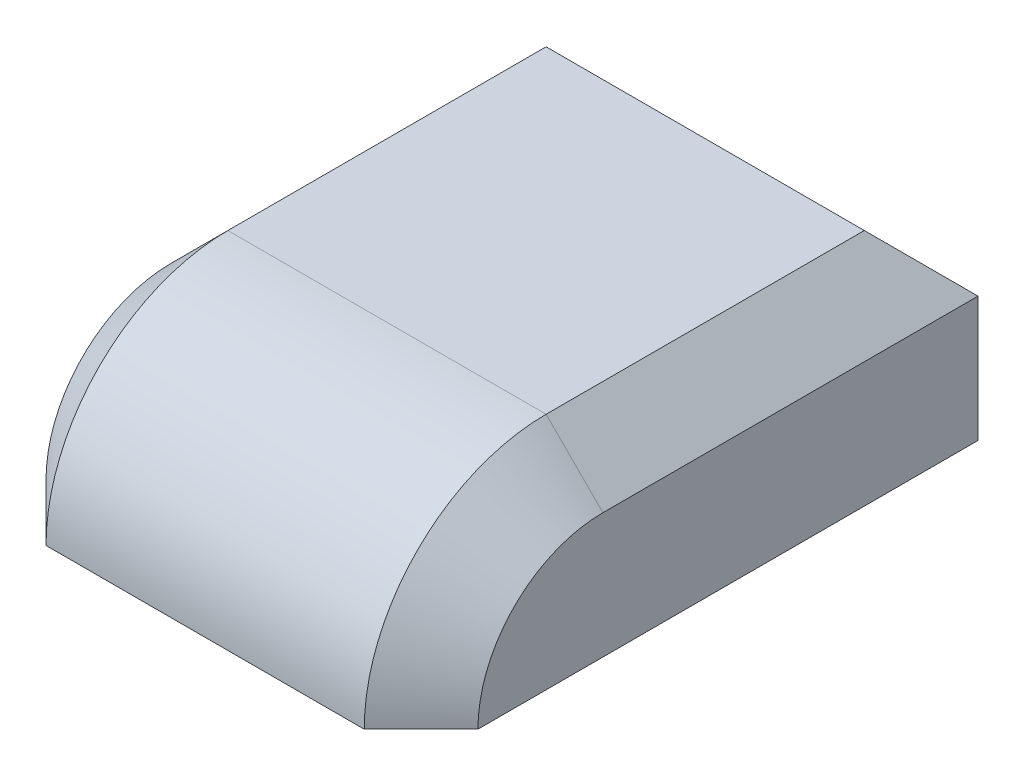
ISO-10303-21;
HEADER;
FILE_DESCRIPTION(('STEP AP214'),'2;1');
FILE_NAME('part.step','',(''),(''),'','','');
FILE_SCHEMA(('AUTOMOTIVE_DESIGN { 1 0 10303 214 1 1 1 1 }'));
ENDSEC;
DATA;
#1=APPLICATION_CONTEXT('core data for automotive mechanical design processes');
#2=APPLICATION_PROTOCOL_DEFINITION('international standard','automotive_design',2000,#1);
#3=PRODUCT_CONTEXT('',#1,'mechanical');
#4=PRODUCT('Part','Part','',(#3));
#5=PRODUCT_RELATED_PRODUCT_CATEGORY('part','',(#4));
#6=PRODUCT_DEFINITION_FORMATION('','',#4);
#7=PRODUCT_DEFINITION_CONTEXT('part definition',#1,'design');
#8=PRODUCT_DEFINITION('design','',#6,#7);
#9=PRODUCT_DEFINITION_SHAPE('','',#8);
#10=(LENGTH_UNIT() NAMED_UNIT(*) SI_UNIT(.MILLI.,.METRE.));
#11=(NAMED_UNIT(*) PLANE_ANGLE_UNIT() SI_UNIT($,.RADIAN.));
#12=(NAMED_UNIT(*) SI_UNIT($,.STERADIAN.) SOLID_ANGLE_UNIT());
#13=UNCERTAINTY_MEASURE_WITH_UNIT(LENGTH_MEASURE(1.E-05),#10,'distance_accuracy_value','');
#14=(GEOMETRIC_REPRESENTATION_CONTEXT(3) GLOBAL_UNCERTAINTY_ASSIGNED_CONTEXT((#13)) GLOBAL_UNIT_ASSIGNED_CONTEXT((#10,
#11,#12)) REPRESENTATION_CONTEXT('',''));
#15=CARTESIAN_POINT('',(0.,0.,0.));
#16=DIRECTION('',(0.,0.,1.));
#17=DIRECTION('',(1.,0.,0.));
#18=AXIS2_PLACEMENT_3D('',#15,#16,#17);
#19=CARTESIAN_POINT('',(19.,16.,24.5));
#20=DIRECTION('',(-1.,0.,0.));
#21=DIRECTION('',(0.,0.,1.));
#22=AXIS2_PLACEMENT_3D('',#19,#20,#21);
#23=PLANE('',#22);
#24=DIRECTION('',(0.,0.,1.));
#25=VECTOR('',#24,1.);
#26=CARTESIAN_POINT('',(19.,11.,24.5));
#27=LINE('',#26,#25);
#28=CARTESIAN_POINT('',(19.,11.,-24.5));
#29=VERTEX_POINT('',#28);
#30=CARTESIAN_POINT('',(19.,11.,8.5));
#31=VERTEX_POINT('',#30);
#32=EDGE_CURVE('E141',#29,#31,#27,.T.);
#33=ORIENTED_EDGE('',*,*,#32,.T.);
#34=CARTESIAN_POINT('',(19.,0.,8.5));
#35=DIRECTION('',(-1.,0.,0.));
#36=DIRECTION('',(0.,0.,1.));
#37=AXIS2_PLACEMENT_3D('',#34,#35,#36);
#38=CIRCLE('',#37,11.);
#39=CARTESIAN_POINT('',(19.,0.,19.5));
#40=VERTEX_POINT('',#39);
#41=EDGE_CURVE('E112',#31,#40,#38,.F.);
#42=ORIENTED_EDGE('',*,*,#41,.T.);
#43=DIRECTION('',(0.,0.,-1.));
#44=VECTOR('',#43,1.);
#45=CARTESIAN_POINT('',(19.,0.,24.5));
#46=LINE('',#45,#44);
#47=CARTESIAN_POINT('',(19.,0.,-24.5));
#48=VERTEX_POINT('',#47);
#49=EDGE_CURVE('E110',#40,#48,#46,.T.);
#50=ORIENTED_EDGE('',*,*,#49,.T.);
#51=DIRECTION('',(0.,-1.,0.));
#52=VECTOR('',#51,1.);
#53=CARTESIAN_POINT('',(19.,16.,-24.5));
#54=LINE('',#53,#52);
#55=EDGE_CURVE('E96',#29,#48,#54,.T.);
#56=ORIENTED_EDGE('',*,*,#55,.F.);
#57=EDGE_LOOP('',(#33,#42,#50,#56));
#58=FACE_BOUND('',#57,.T.);
#59=ADVANCED_FACE('F35',(#58),#23,.F.);
#60=CARTESIAN_POINT('',(-19.,16.,-24.5));
#61=DIRECTION('',(0.,0.,1.));
#62=DIRECTION('',(1.,0.,0.));
#63=AXIS2_PLACEMENT_3D('',#60,#61,#62);
#64=PLANE('',#63);
#65=DIRECTION('',(0.,-1.,0.));
#66=VECTOR('',#65,1.);
#67=CARTESIAN_POINT('',(-19.,16.,-24.5));
#68=LINE('',#67,#66);
#69=CARTESIAN_POINT('',(-19.,11.,-24.5));
#70=VERTEX_POINT('',#69);
#71=CARTESIAN_POINT('',(-19.,0.,-24.5));
#72=VERTEX_POINT('',#71);
#73=EDGE_CURVE('E107',#70,#72,#68,.T.);
#74=ORIENTED_EDGE('',*,*,#73,.F.);
#75=DIRECTION('',(1.,0.,0.));
#76=VECTOR('',#75,1.);
#77=CARTESIAN_POINT('',(-19.,11.,-24.5));
#78=LINE('',#77,#76);
#79=EDGE_CURVE('E11',#70,#29,#78,.T.);
#80=ORIENTED_EDGE('',*,*,#79,.T.);
#81=ORIENTED_EDGE('',*,*,#55,.T.);
#82=DIRECTION('',(-1.,0.,0.));
#83=VECTOR('',#82,1.);
#84=CARTESIAN_POINT('',(-19.,0.,-24.5));
#85=LINE('',#84,#83);
#86=EDGE_CURVE('E101',#48,#72,#85,.T.);
#87=ORIENTED_EDGE('',*,*,#86,.T.);
#88=EDGE_LOOP('',(#74,#80,#81,#87));
#89=FACE_BOUND('',#88,.T.);
#90=ADVANCED_FACE('F99',(#89),#64,.F.);
#91=CARTESIAN_POINT('',(-19.,16.,24.5));
#92=DIRECTION('',(1.,0.,0.));
#93=DIRECTION('',(0.,0.,-1.));
#94=AXIS2_PLACEMENT_3D('',#91,#92,#93);
#95=PLANE('',#94);
#96=DIRECTION('',(0.,0.,1.));
#97=VECTOR('',#96,1.);
#98=CARTESIAN_POINT('',(-19.,0.,24.5));
#99=LINE('',#98,#97);
#100=CARTESIAN_POINT('',(-19.,0.,19.5));
#101=VERTEX_POINT('',#100);
#102=EDGE_CURVE('E119',#72,#101,#99,.T.);
#103=ORIENTED_EDGE('',*,*,#102,.T.);
#104=CARTESIAN_POINT('',(-19.,0.,8.5));
#105=DIRECTION('',(1.,0.,0.));
#106=DIRECTION('',(0.,0.,-1.));
#107=AXIS2_PLACEMENT_3D('',#104,#105,#106);
#108=CIRCLE('',#107,11.);
#109=CARTESIAN_POINT('',(-19.,11.,8.5));
#110=VERTEX_POINT('',#109);
#111=EDGE_CURVE('E130',#101,#110,#108,.F.);
#112=ORIENTED_EDGE('',*,*,#111,.T.);
#113=DIRECTION('',(0.,0.,-1.));
#114=VECTOR('',#113,1.);
#115=CARTESIAN_POINT('',(-19.,11.,24.5));
#116=LINE('',#115,#114);
#117=EDGE_CURVE('E128',#110,#70,#116,.T.);
#118=ORIENTED_EDGE('',*,*,#117,.T.);
#119=ORIENTED_EDGE('',*,*,#73,.T.);
#120=EDGE_LOOP('',(#103,#112,#118,#119));
#121=FACE_BOUND('',#120,.T.);
#122=ADVANCED_FACE('F174',(#121),#95,.F.);
#123=CARTESIAN_POINT('',(0.,16.,0.));
#124=DIRECTION('',(0.,-1.,0.));
#125=DIRECTION('',(0.,0.,-1.));
#126=AXIS2_PLACEMENT_3D('',#123,#124,#125);
#127=PLANE('',#126);
#128=DIRECTION('',(-1.,0.,0.));
#129=VECTOR('',#128,1.);
#130=CARTESIAN_POINT('',(0.,16.,-19.5));
#131=LINE('',#130,#129);
#132=CARTESIAN_POINT('',(14.,16.,-19.5));
#133=VERTEX_POINT('',#132);
#134=CARTESIAN_POINT('',(-14.,16.,-19.5));
#135=VERTEX_POINT('',#134);
#136=EDGE_CURVE('E53',#133,#135,#131,.T.);
#137=ORIENTED_EDGE('',*,*,#136,.T.);
#138=DIRECTION('',(0.,0.,1.));
#139=VECTOR('',#138,1.);
#140=CARTESIAN_POINT('',(-14.,16.,0.));
#141=LINE('',#140,#139);
#142=CARTESIAN_POINT('',(-14.,16.,8.5));
#143=VERTEX_POINT('',#142);
#144=EDGE_CURVE('E45',#135,#143,#141,.T.);
#145=ORIENTED_EDGE('',*,*,#144,.T.);
#146=DIRECTION('',(1.,0.,0.));
#147=VECTOR('',#146,1.);
#148=CARTESIAN_POINT('',(0.,16.,8.5));
#149=LINE('',#148,#147);
#150=CARTESIAN_POINT('',(14.,16.,8.5));
#151=VERTEX_POINT('',#150);
#152=EDGE_CURVE('E106',#143,#151,#149,.T.);
#153=ORIENTED_EDGE('',*,*,#152,.T.);
#154=DIRECTION('',(0.,0.,-1.));
#155=VECTOR('',#154,1.);
#156=CARTESIAN_POINT('',(14.,16.,0.));
#157=LINE('',#156,#155);
#158=EDGE_CURVE('E58',#151,#133,#157,.T.);
#159=ORIENTED_EDGE('',*,*,#158,.T.);
#160=EDGE_LOOP('',(#137,#145,#153,#159));
#161=FACE_BOUND('',#160,.T.);
#162=ADVANCED_FACE('F246',(#161),#127,.F.);
#163=CARTESIAN_POINT('',(0.,0.,0.));
#164=DIRECTION('',(0.,-1.,0.));
#165=DIRECTION('',(0.,0.,-1.));
#166=AXIS2_PLACEMENT_3D('',#163,#164,#165);
#167=PLANE('',#166);
#168=DIRECTION('',(1.,0.,0.));
#169=VECTOR('',#168,1.);
#170=CARTESIAN_POINT('',(-19.,0.,24.5));
#171=LINE('',#170,#169);
#172=CARTESIAN_POINT('',(-14.,0.,24.5));
#173=VERTEX_POINT('',#172);
#174=CARTESIAN_POINT('',(14.,0.,24.5));
#175=VERTEX_POINT('',#174);
#176=EDGE_CURVE('E121',#173,#175,#171,.T.);
#177=ORIENTED_EDGE('',*,*,#176,.F.);
#178=DIRECTION('',(-0.707106781186546,0.,-0.707106781186549));
#179=VECTOR('',#178,1.);
#180=CARTESIAN_POINT('',(-29.9999999999999,0.,8.5));
#181=LINE('',#180,#179);
#182=EDGE_CURVE('E139',#173,#101,#181,.T.);
#183=ORIENTED_EDGE('',*,*,#182,.T.);
#184=ORIENTED_EDGE('',*,*,#102,.F.);
#185=ORIENTED_EDGE('',*,*,#86,.F.);
#186=ORIENTED_EDGE('',*,*,#49,.F.);
#187=DIRECTION('',(-0.707106781186546,0.,0.707106781186549));
#188=VECTOR('',#187,1.);
#189=CARTESIAN_POINT('',(29.9999999999999,0.,8.5));
#190=LINE('',#189,#188);
#191=EDGE_CURVE('E137',#40,#175,#190,.T.);
#192=ORIENTED_EDGE('',*,*,#191,.T.);
#193=EDGE_LOOP('',(#177,#183,#184,#185,#186,#192));
#194=FACE_BOUND('',#193,.T.);
#195=ADVANCED_FACE('F117',(#194),#167,.T.);
#196=CARTESIAN_POINT('',(0.,0.,8.5));
#197=DIRECTION('',(1.,0.,0.));
#198=DIRECTION('',(0.,0.,-1.));
#199=AXIS2_PLACEMENT_3D('',#196,#197,#198);
#200=CYLINDRICAL_SURFACE('',#199,16.);
#201=ORIENTED_EDGE('',*,*,#152,.F.);
#202=CARTESIAN_POINT('',(-14.,0.,8.5));
#203=DIRECTION('',(1.,0.,0.));
#204=DIRECTION('',(0.,0.,-1.));
#205=AXIS2_PLACEMENT_3D('',#202,#203,#204);
#206=CIRCLE('',#205,16.);
#207=EDGE_CURVE('E135',#143,#173,#206,.T.);
#208=ORIENTED_EDGE('',*,*,#207,.T.);
#209=ORIENTED_EDGE('',*,*,#176,.T.);
#210=CARTESIAN_POINT('',(14.,0.,8.5));
#211=DIRECTION('',(-1.,0.,0.));
#212=DIRECTION('',(0.,0.,1.));
#213=AXIS2_PLACEMENT_3D('',#210,#211,#212);
#214=CIRCLE('',#213,16.);
#215=EDGE_CURVE('E133',#175,#151,#214,.T.);
#216=ORIENTED_EDGE('',*,*,#215,.T.);
#217=EDGE_LOOP('',(#201,#208,#209,#216));
#218=FACE_BOUND('',#217,.T.);
#219=ADVANCED_FACE('F163',(#218),#200,.T.);
#220=CARTESIAN_POINT('',(19.,0.,8.5));
#221=DIRECTION('',(-1.,0.,0.));
#222=DIRECTION('',(0.,0.,1.));
#223=AXIS2_PLACEMENT_3D('',#220,#221,#222);
#224=CONICAL_SURFACE('',#223,11.,0.785398163397451);
#225=ORIENTED_EDGE('',*,*,#191,.F.);
#226=ORIENTED_EDGE('',*,*,#41,.F.);
#227=DIRECTION('',(0.707106781186546,-0.70710678118655,0.));
#228=VECTOR('',#227,1.);
#229=CARTESIAN_POINT('',(14.,16.,8.5));
#230=LINE('',#229,#228);
#231=EDGE_CURVE('E40',#151,#31,#230,.T.);
#232=ORIENTED_EDGE('',*,*,#231,.F.);
#233=ORIENTED_EDGE('',*,*,#215,.F.);
#234=EDGE_LOOP('',(#225,#226,#232,#233));
#235=FACE_BOUND('',#234,.T.);
#236=ADVANCED_FACE('F38',(#235),#224,.T.);
#237=CARTESIAN_POINT('',(14.,16.,0.));
#238=DIRECTION('',(-0.70710678118655,-0.707106781186546,0.));
#239=DIRECTION('',(0.,0.,-1.));
#240=AXIS2_PLACEMENT_3D('',#237,#238,#239);
#241=PLANE('',#240);
#242=ORIENTED_EDGE('',*,*,#231,.T.);
#243=ORIENTED_EDGE('',*,*,#32,.F.);
#244=DIRECTION('',(-0.577350269189625,0.577350269189628,0.577350269189625));
#245=VECTOR('',#244,1.);
#246=CARTESIAN_POINT('',(7.50000000000003,22.5,-13.));
#247=LINE('',#246,#245);
#248=EDGE_CURVE('E151',#133,#29,#247,.F.);
#249=ORIENTED_EDGE('',*,*,#248,.F.);
#250=ORIENTED_EDGE('',*,*,#158,.F.);
#251=EDGE_LOOP('',(#242,#243,#249,#250));
#252=FACE_BOUND('',#251,.T.);
#253=ADVANCED_FACE('F157',(#252),#241,.F.);
#254=CARTESIAN_POINT('',(0.,16.,-19.5));
#255=DIRECTION('',(0.,-0.707106781186546,0.70710678118655));
#256=DIRECTION('',(-1.,0.,0.));
#257=AXIS2_PLACEMENT_3D('',#254,#255,#256);
#258=PLANE('',#257);
#259=ORIENTED_EDGE('',*,*,#248,.T.);
#260=ORIENTED_EDGE('',*,*,#79,.F.);
#261=DIRECTION('',(0.577350269189625,0.577350269189628,0.577350269189625));
#262=VECTOR('',#261,1.);
#263=CARTESIAN_POINT('',(-9.33333333333335,20.6666666666667,-14.8333333333334));
#264=LINE('',#263,#262);
#265=EDGE_CURVE('E149',#135,#70,#264,.F.);
#266=ORIENTED_EDGE('',*,*,#265,.F.);
#267=ORIENTED_EDGE('',*,*,#136,.F.);
#268=EDGE_LOOP('',(#259,#260,#266,#267));
#269=FACE_BOUND('',#268,.T.);
#270=ADVANCED_FACE('F175',(#269),#258,.F.);
#271=CARTESIAN_POINT('',(-14.,16.,0.));
#272=DIRECTION('',(0.70710678118655,-0.707106781186546,0.));
#273=DIRECTION('',(0.,0.,1.));
#274=AXIS2_PLACEMENT_3D('',#271,#272,#273);
#275=PLANE('',#274);
#276=ORIENTED_EDGE('',*,*,#265,.T.);
#277=ORIENTED_EDGE('',*,*,#117,.F.);
#278=DIRECTION('',(-0.707106781186546,-0.70710678118655,0.));
#279=VECTOR('',#278,1.);
#280=CARTESIAN_POINT('',(-14.,16.,8.5));
#281=LINE('',#280,#279);
#282=EDGE_CURVE('E147',#143,#110,#281,.T.);
#283=ORIENTED_EDGE('',*,*,#282,.F.);
#284=ORIENTED_EDGE('',*,*,#144,.F.);
#285=EDGE_LOOP('',(#276,#277,#283,#284));
#286=FACE_BOUND('',#285,.T.);
#287=ADVANCED_FACE('F172',(#286),#275,.F.);
#288=CARTESIAN_POINT('',(-19.,0.,8.5));
#289=DIRECTION('',(1.,0.,0.));
#290=DIRECTION('',(0.,0.,-1.));
#291=AXIS2_PLACEMENT_3D('',#288,#289,#290);
#292=CONICAL_SURFACE('',#291,11.,0.785398163397451);
#293=ORIENTED_EDGE('',*,*,#182,.F.);
#294=ORIENTED_EDGE('',*,*,#207,.F.);
#295=ORIENTED_EDGE('',*,*,#282,.T.);
#296=ORIENTED_EDGE('',*,*,#111,.F.);
#297=EDGE_LOOP('',(#293,#294,#295,#296));
#298=FACE_BOUND('',#297,.T.);
#299=ADVANCED_FACE('F167',(#298),#292,.T.);
#300=CLOSED_SHELL('',(#59,#90,#122,#162,#195,#219,#236,#253,#270,#287,#299));
#301=MANIFOLD_SOLID_BREP('B2',#300);
#302=ADVANCED_BREP_SHAPE_REPRESENTATION('',(#18,#301),#14);
#303=SHAPE_DEFINITION_REPRESENTATION(#9,#302);
ENDSEC;
END-ISO-10303-21;
